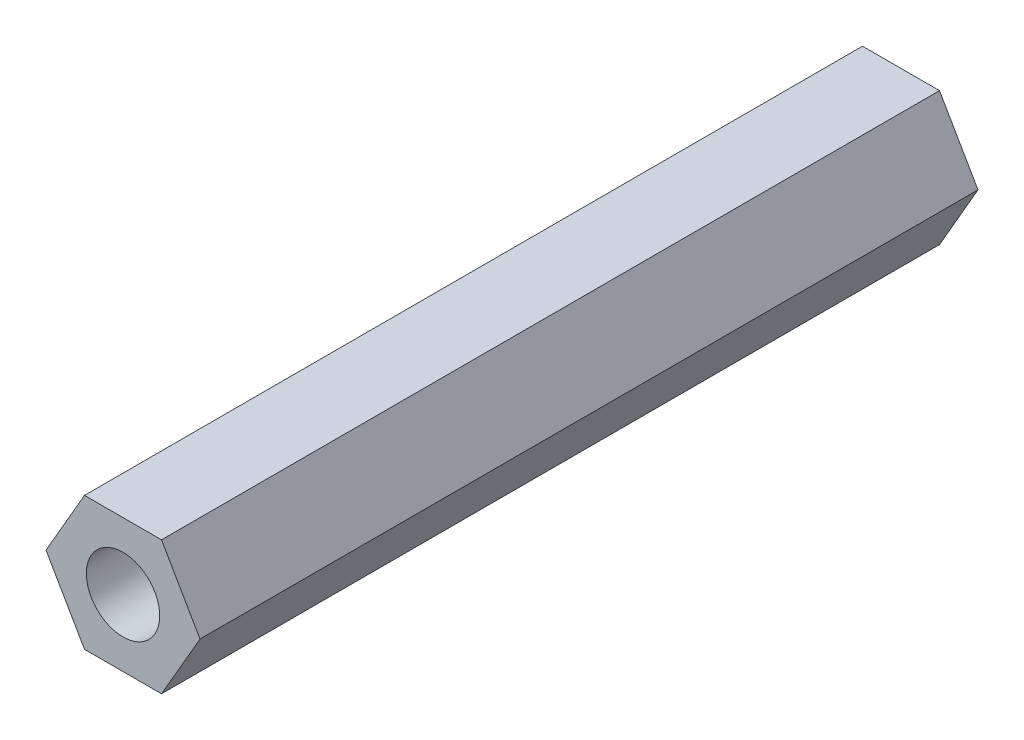
ISO-10303-21;
HEADER;
FILE_DESCRIPTION(('STEP AP214'),'2;1');
FILE_NAME('part.step','',(''),(''),'','','');
FILE_SCHEMA(('AUTOMOTIVE_DESIGN { 1 0 10303 214 1 1 1 1 }'));
ENDSEC;
DATA;
#1=APPLICATION_CONTEXT('core data for automotive mechanical design processes');
#2=APPLICATION_PROTOCOL_DEFINITION('international standard','automotive_design',2000,#1);
#3=PRODUCT_CONTEXT('',#1,'mechanical');
#4=PRODUCT('Part','Part','',(#3));
#5=PRODUCT_RELATED_PRODUCT_CATEGORY('part','',(#4));
#6=PRODUCT_DEFINITION_FORMATION('','',#4);
#7=PRODUCT_DEFINITION_CONTEXT('part definition',#1,'design');
#8=PRODUCT_DEFINITION('design','',#6,#7);
#9=PRODUCT_DEFINITION_SHAPE('','',#8);
#10=(LENGTH_UNIT() NAMED_UNIT(*) SI_UNIT(.MILLI.,.METRE.));
#11=(NAMED_UNIT(*) PLANE_ANGLE_UNIT() SI_UNIT($,.RADIAN.));
#12=(NAMED_UNIT(*) SI_UNIT($,.STERADIAN.) SOLID_ANGLE_UNIT());
#13=UNCERTAINTY_MEASURE_WITH_UNIT(LENGTH_MEASURE(1.E-05),#10,'distance_accuracy_value','');
#14=(GEOMETRIC_REPRESENTATION_CONTEXT(3) GLOBAL_UNCERTAINTY_ASSIGNED_CONTEXT((#13)) GLOBAL_UNIT_ASSIGNED_CONTEXT((#10,
#11,#12)) REPRESENTATION_CONTEXT('',''));
#15=CARTESIAN_POINT('',(0.,0.,0.));
#16=DIRECTION('',(0.,0.,1.));
#17=DIRECTION('',(1.,0.,0.));
#18=AXIS2_PLACEMENT_3D('',#15,#16,#17);
#19=CARTESIAN_POINT('',(-1.73205080756888,-3.,35.));
#20=DIRECTION('',(0.866025403784439,-0.5,0.));
#21=DIRECTION('',(0.5,0.866025403784439,0.));
#22=AXIS2_PLACEMENT_3D('',#19,#20,#21);
#23=PLANE('',#22);
#24=DIRECTION('',(-0.5,-0.866025403784439,0.));
#25=VECTOR('',#24,1.);
#26=CARTESIAN_POINT('',(-1.73205080756888,-3.,0.));
#27=LINE('',#26,#25);
#28=CARTESIAN_POINT('',(0.,0.,0.));
#29=VERTEX_POINT('',#28);
#30=CARTESIAN_POINT('',(-1.73205080756888,-3.,0.));
#31=VERTEX_POINT('',#30);
#32=EDGE_CURVE('E121',#29,#31,#27,.T.);
#33=ORIENTED_EDGE('',*,*,#32,.T.);
#34=DIRECTION('',(0.,0.,-1.));
#35=VECTOR('',#34,1.);
#36=CARTESIAN_POINT('',(-1.73205080756888,-3.,35.));
#37=LINE('',#36,#35);
#38=CARTESIAN_POINT('',(-1.73205080756888,-3.,35.));
#39=VERTEX_POINT('',#38);
#40=EDGE_CURVE('E11',#39,#31,#37,.T.);
#41=ORIENTED_EDGE('',*,*,#40,.F.);
#42=DIRECTION('',(-0.5,-0.866025403784439,0.));
#43=VECTOR('',#42,1.);
#44=CARTESIAN_POINT('',(-1.73205080756888,-3.,35.));
#45=LINE('',#44,#43);
#46=CARTESIAN_POINT('',(0.,0.,35.));
#47=VERTEX_POINT('',#46);
#48=EDGE_CURVE('E132',#47,#39,#45,.T.);
#49=ORIENTED_EDGE('',*,*,#48,.F.);
#50=DIRECTION('',(0.,0.,-1.));
#51=VECTOR('',#50,1.);
#52=CARTESIAN_POINT('',(0.,0.,35.));
#53=LINE('',#52,#51);
#54=EDGE_CURVE('E117',#47,#29,#53,.T.);
#55=ORIENTED_EDGE('',*,*,#54,.T.);
#56=EDGE_LOOP('',(#33,#41,#49,#55));
#57=FACE_BOUND('',#56,.T.);
#58=ADVANCED_FACE('F37',(#57),#23,.F.);
#59=CARTESIAN_POINT('',(0.,-6.,35.));
#60=DIRECTION('',(0.866025403784439,0.5,0.));
#61=DIRECTION('',(-0.5,0.866025403784439,0.));
#62=AXIS2_PLACEMENT_3D('',#59,#60,#61);
#63=PLANE('',#62);
#64=DIRECTION('',(0.5,-0.866025403784439,0.));
#65=VECTOR('',#64,1.);
#66=CARTESIAN_POINT('',(0.,-6.,0.));
#67=LINE('',#66,#65);
#68=CARTESIAN_POINT('',(0.,-6.,0.));
#69=VERTEX_POINT('',#68);
#70=EDGE_CURVE('E124',#31,#69,#67,.T.);
#71=ORIENTED_EDGE('',*,*,#70,.T.);
#72=DIRECTION('',(0.,0.,-1.));
#73=VECTOR('',#72,1.);
#74=CARTESIAN_POINT('',(0.,-6.,35.));
#75=LINE('',#74,#73);
#76=CARTESIAN_POINT('',(0.,-6.,35.));
#77=VERTEX_POINT('',#76);
#78=EDGE_CURVE('E45',#77,#69,#75,.T.);
#79=ORIENTED_EDGE('',*,*,#78,.F.);
#80=DIRECTION('',(0.5,-0.866025403784439,0.));
#81=VECTOR('',#80,1.);
#82=CARTESIAN_POINT('',(0.,-6.,35.));
#83=LINE('',#82,#81);
#84=EDGE_CURVE('E90',#39,#77,#83,.T.);
#85=ORIENTED_EDGE('',*,*,#84,.F.);
#86=ORIENTED_EDGE('',*,*,#40,.T.);
#87=EDGE_LOOP('',(#71,#79,#85,#86));
#88=FACE_BOUND('',#87,.T.);
#89=ADVANCED_FACE('F157',(#88),#63,.F.);
#90=CARTESIAN_POINT('',(3.46410161513775,-6.,35.));
#91=DIRECTION('',(0.,1.,0.));
#92=DIRECTION('',(0.,0.,1.));
#93=AXIS2_PLACEMENT_3D('',#90,#91,#92);
#94=PLANE('',#93);
#95=DIRECTION('',(1.,0.,0.));
#96=VECTOR('',#95,1.);
#97=CARTESIAN_POINT('',(3.46410161513775,-6.,0.));
#98=LINE('',#97,#96);
#99=CARTESIAN_POINT('',(3.46410161513775,-6.,0.));
#100=VERTEX_POINT('',#99);
#101=EDGE_CURVE('E127',#69,#100,#98,.T.);
#102=ORIENTED_EDGE('',*,*,#101,.T.);
#103=DIRECTION('',(0.,0.,-1.));
#104=VECTOR('',#103,1.);
#105=CARTESIAN_POINT('',(3.46410161513775,-6.,35.));
#106=LINE('',#105,#104);
#107=CARTESIAN_POINT('',(3.46410161513775,-6.,35.));
#108=VERTEX_POINT('',#107);
#109=EDGE_CURVE('E112',#108,#100,#106,.T.);
#110=ORIENTED_EDGE('',*,*,#109,.F.);
#111=DIRECTION('',(1.,0.,0.));
#112=VECTOR('',#111,1.);
#113=CARTESIAN_POINT('',(3.46410161513775,-6.,35.));
#114=LINE('',#113,#112);
#115=EDGE_CURVE('E103',#77,#108,#114,.T.);
#116=ORIENTED_EDGE('',*,*,#115,.F.);
#117=ORIENTED_EDGE('',*,*,#78,.T.);
#118=EDGE_LOOP('',(#102,#110,#116,#117));
#119=FACE_BOUND('',#118,.T.);
#120=ADVANCED_FACE('F138',(#119),#94,.F.);
#121=CARTESIAN_POINT('',(5.19615242270663,-3.,35.));
#122=DIRECTION('',(-0.866025403784439,0.5,0.));
#123=DIRECTION('',(-0.5,-0.866025403784439,0.));
#124=AXIS2_PLACEMENT_3D('',#121,#122,#123);
#125=PLANE('',#124);
#126=DIRECTION('',(0.5,0.866025403784439,0.));
#127=VECTOR('',#126,1.);
#128=CARTESIAN_POINT('',(5.19615242270663,-3.,0.));
#129=LINE('',#128,#127);
#130=CARTESIAN_POINT('',(5.19615242270663,-3.,0.));
#131=VERTEX_POINT('',#130);
#132=EDGE_CURVE('E111',#100,#131,#129,.T.);
#133=ORIENTED_EDGE('',*,*,#132,.T.);
#134=DIRECTION('',(0.,0.,-1.));
#135=VECTOR('',#134,1.);
#136=CARTESIAN_POINT('',(5.19615242270663,-3.,35.));
#137=LINE('',#136,#135);
#138=CARTESIAN_POINT('',(5.19615242270663,-3.,35.));
#139=VERTEX_POINT('',#138);
#140=EDGE_CURVE('E108',#139,#131,#137,.T.);
#141=ORIENTED_EDGE('',*,*,#140,.F.);
#142=DIRECTION('',(0.5,0.866025403784439,0.));
#143=VECTOR('',#142,1.);
#144=CARTESIAN_POINT('',(5.19615242270663,-3.,35.));
#145=LINE('',#144,#143);
#146=EDGE_CURVE('E97',#108,#139,#145,.T.);
#147=ORIENTED_EDGE('',*,*,#146,.F.);
#148=ORIENTED_EDGE('',*,*,#109,.T.);
#149=EDGE_LOOP('',(#133,#141,#147,#148));
#150=FACE_BOUND('',#149,.T.);
#151=ADVANCED_FACE('F109',(#150),#125,.F.);
#152=CARTESIAN_POINT('',(3.46410161513775,0.,35.));
#153=DIRECTION('',(-0.866025403784439,-0.5,0.));
#154=DIRECTION('',(0.5,-0.866025403784439,0.));
#155=AXIS2_PLACEMENT_3D('',#152,#153,#154);
#156=PLANE('',#155);
#157=DIRECTION('',(-0.5,0.866025403784439,0.));
#158=VECTOR('',#157,1.);
#159=CARTESIAN_POINT('',(3.46410161513775,0.,0.));
#160=LINE('',#159,#158);
#161=CARTESIAN_POINT('',(3.46410161513775,0.,0.));
#162=VERTEX_POINT('',#161);
#163=EDGE_CURVE('E76',#131,#162,#160,.T.);
#164=ORIENTED_EDGE('',*,*,#163,.T.);
#165=DIRECTION('',(0.,0.,-1.));
#166=VECTOR('',#165,1.);
#167=CARTESIAN_POINT('',(3.46410161513775,0.,35.));
#168=LINE('',#167,#166);
#169=CARTESIAN_POINT('',(3.46410161513775,0.,35.));
#170=VERTEX_POINT('',#169);
#171=EDGE_CURVE('E113',#170,#162,#168,.T.);
#172=ORIENTED_EDGE('',*,*,#171,.F.);
#173=DIRECTION('',(-0.5,0.866025403784439,0.));
#174=VECTOR('',#173,1.);
#175=CARTESIAN_POINT('',(3.46410161513775,0.,35.));
#176=LINE('',#175,#174);
#177=EDGE_CURVE('E101',#139,#170,#176,.T.);
#178=ORIENTED_EDGE('',*,*,#177,.F.);
#179=ORIENTED_EDGE('',*,*,#140,.T.);
#180=EDGE_LOOP('',(#164,#172,#178,#179));
#181=FACE_BOUND('',#180,.T.);
#182=ADVANCED_FACE('F115',(#181),#156,.F.);
#183=CARTESIAN_POINT('',(0.,0.,35.));
#184=DIRECTION('',(0.,-1.,0.));
#185=DIRECTION('',(1.,0.,0.));
#186=AXIS2_PLACEMENT_3D('',#183,#184,#185);
#187=PLANE('',#186);
#188=DIRECTION('',(-1.,0.,0.));
#189=VECTOR('',#188,1.);
#190=CARTESIAN_POINT('',(0.,0.,0.));
#191=LINE('',#190,#189);
#192=EDGE_CURVE('E82',#162,#29,#191,.T.);
#193=ORIENTED_EDGE('',*,*,#192,.T.);
#194=ORIENTED_EDGE('',*,*,#54,.F.);
#195=DIRECTION('',(-1.,0.,0.));
#196=VECTOR('',#195,1.);
#197=CARTESIAN_POINT('',(0.,0.,35.));
#198=LINE('',#197,#196);
#199=EDGE_CURVE('E53',#170,#47,#198,.T.);
#200=ORIENTED_EDGE('',*,*,#199,.F.);
#201=ORIENTED_EDGE('',*,*,#171,.T.);
#202=EDGE_LOOP('',(#193,#194,#200,#201));
#203=FACE_BOUND('',#202,.T.);
#204=ADVANCED_FACE('F145',(#203),#187,.F.);
#205=CARTESIAN_POINT('',(0.,0.,35.));
#206=DIRECTION('',(0.,0.,-1.));
#207=DIRECTION('',(-1.,0.,0.));
#208=AXIS2_PLACEMENT_3D('',#205,#206,#207);
#209=PLANE('',#208);
#210=CARTESIAN_POINT('',(1.73205080756888,-3.,35.));
#211=DIRECTION('',(0.,0.,1.));
#212=DIRECTION('',(1.,0.,0.));
#213=AXIS2_PLACEMENT_3D('',#210,#211,#212);
#214=CIRCLE('',#213,1.65);
#215=CARTESIAN_POINT('',(3.38205080756887,-3.,35.));
#216=VERTEX_POINT('',#215);
#217=EDGE_CURVE('E214',#216,#216,#214,.T.);
#218=ORIENTED_EDGE('',*,*,#217,.F.);
#219=EDGE_LOOP('',(#218));
#220=FACE_BOUND('',#219,.T.);
#221=ORIENTED_EDGE('',*,*,#48,.T.);
#222=ORIENTED_EDGE('',*,*,#84,.T.);
#223=ORIENTED_EDGE('',*,*,#115,.T.);
#224=ORIENTED_EDGE('',*,*,#146,.T.);
#225=ORIENTED_EDGE('',*,*,#177,.T.);
#226=ORIENTED_EDGE('',*,*,#199,.T.);
#227=EDGE_LOOP('',(#221,#222,#223,#224,#225,#226));
#228=FACE_BOUND('',#227,.T.);
#229=ADVANCED_FACE('F99',(#220,#228),#209,.F.);
#230=CARTESIAN_POINT('',(0.,0.,0.));
#231=DIRECTION('',(0.,0.,-1.));
#232=DIRECTION('',(-1.,0.,0.));
#233=AXIS2_PLACEMENT_3D('',#230,#231,#232);
#234=PLANE('',#233);
#235=CARTESIAN_POINT('',(1.73205080756888,-3.,0.));
#236=DIRECTION('',(0.,0.,1.));
#237=DIRECTION('',(1.,0.,0.));
#238=AXIS2_PLACEMENT_3D('',#235,#236,#237);
#239=CIRCLE('',#238,1.64999999999999);
#240=CARTESIAN_POINT('',(3.38205080756887,-3.,0.));
#241=VERTEX_POINT('',#240);
#242=EDGE_CURVE('E125',#241,#241,#239,.T.);
#243=ORIENTED_EDGE('',*,*,#242,.T.);
#244=EDGE_LOOP('',(#243));
#245=FACE_BOUND('',#244,.T.);
#246=ORIENTED_EDGE('',*,*,#32,.F.);
#247=ORIENTED_EDGE('',*,*,#192,.F.);
#248=ORIENTED_EDGE('',*,*,#163,.F.);
#249=ORIENTED_EDGE('',*,*,#132,.F.);
#250=ORIENTED_EDGE('',*,*,#101,.F.);
#251=ORIENTED_EDGE('',*,*,#70,.F.);
#252=EDGE_LOOP('',(#246,#247,#248,#249,#250,#251));
#253=FACE_BOUND('',#252,.T.);
#254=ADVANCED_FACE('F141',(#245,#253),#234,.T.);
#255=CARTESIAN_POINT('',(1.73205080756888,-3.,35.));
#256=DIRECTION('',(0.,0.,1.));
#257=DIRECTION('',(1.,0.,0.));
#258=AXIS2_PLACEMENT_3D('',#255,#256,#257);
#259=CYLINDRICAL_SURFACE('',#258,1.64999999999999);
#260=ORIENTED_EDGE('',*,*,#242,.F.);
#261=EDGE_LOOP('',(#260));
#262=FACE_BOUND('',#261,.T.);
#263=ORIENTED_EDGE('',*,*,#217,.T.);
#264=EDGE_LOOP('',(#263));
#265=FACE_BOUND('',#264,.T.);
#266=ADVANCED_FACE('F194',(#262,#265),#259,.F.);
#267=CLOSED_SHELL('',(#58,#89,#120,#151,#182,#204,#229,#254,#266));
#268=MANIFOLD_SOLID_BREP('B2',#267);
#269=ADVANCED_BREP_SHAPE_REPRESENTATION('',(#18,#268),#14);
#270=SHAPE_DEFINITION_REPRESENTATION(#9,#269);
ENDSEC;
END-ISO-10303-21;
